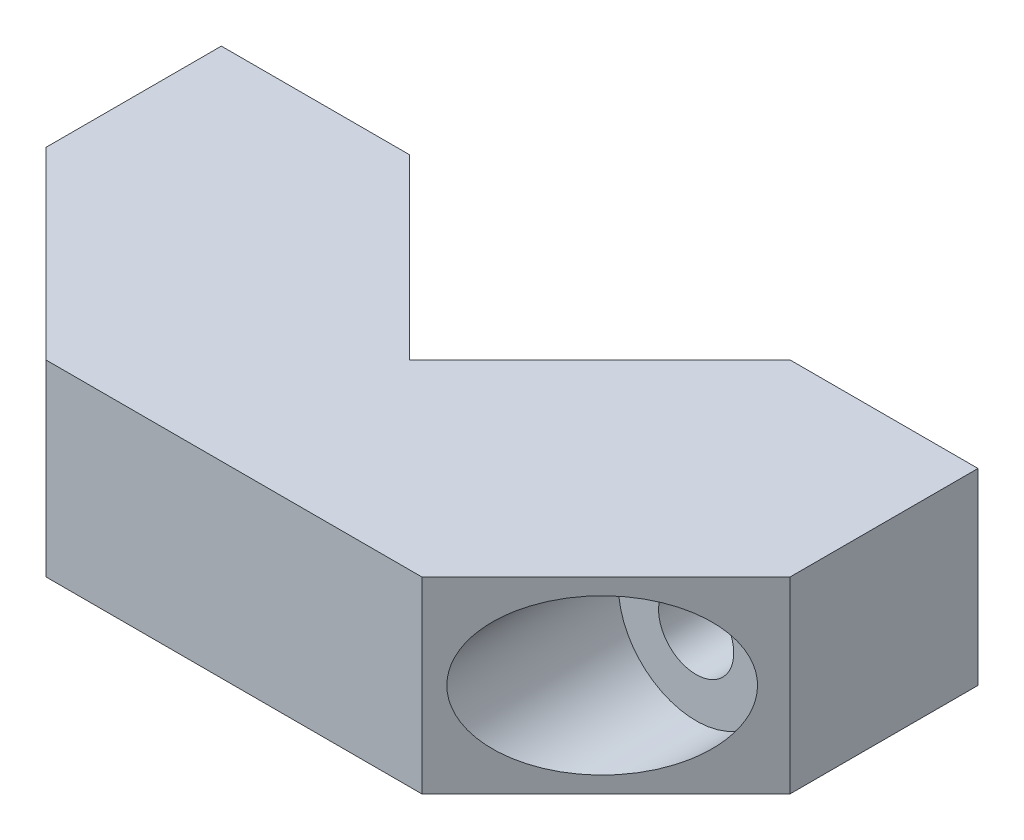
ISO-10303-21;
HEADER;
FILE_DESCRIPTION(('STEP AP214'),'2;1');
FILE_NAME('part.step','',(''),(''),'','','');
FILE_SCHEMA(('AUTOMOTIVE_DESIGN { 1 0 10303 214 1 1 1 1 }'));
ENDSEC;
DATA;
#1=APPLICATION_CONTEXT('core data for automotive mechanical design processes');
#2=APPLICATION_PROTOCOL_DEFINITION('international standard','automotive_design',2000,#1);
#3=PRODUCT_CONTEXT('',#1,'mechanical');
#4=PRODUCT('Part','Part','',(#3));
#5=PRODUCT_RELATED_PRODUCT_CATEGORY('part','',(#4));
#6=PRODUCT_DEFINITION_FORMATION('','',#4);
#7=PRODUCT_DEFINITION_CONTEXT('part definition',#1,'design');
#8=PRODUCT_DEFINITION('design','',#6,#7);
#9=PRODUCT_DEFINITION_SHAPE('','',#8);
#10=(LENGTH_UNIT() NAMED_UNIT(*) SI_UNIT(.MILLI.,.METRE.));
#11=(NAMED_UNIT(*) PLANE_ANGLE_UNIT() SI_UNIT($,.RADIAN.));
#12=(NAMED_UNIT(*) SI_UNIT($,.STERADIAN.) SOLID_ANGLE_UNIT());
#13=UNCERTAINTY_MEASURE_WITH_UNIT(LENGTH_MEASURE(1.E-05),#10,'distance_accuracy_value','');
#14=(GEOMETRIC_REPRESENTATION_CONTEXT(3) GLOBAL_UNCERTAINTY_ASSIGNED_CONTEXT((#13)) GLOBAL_UNIT_ASSIGNED_CONTEXT((#10,
#11,#12)) REPRESENTATION_CONTEXT('',''));
#15=CARTESIAN_POINT('',(0.,0.,0.));
#16=DIRECTION('',(0.,0.,1.));
#17=DIRECTION('',(1.,0.,0.));
#18=AXIS2_PLACEMENT_3D('',#15,#16,#17);
#19=CARTESIAN_POINT('',(-36.1259523138163,12.7,-11.8011320819841));
#20=DIRECTION('',(0.,0.,1.));
#21=DIRECTION('',(1.,0.,0.));
#22=AXIS2_PLACEMENT_3D('',#19,#20,#21);
#23=PLANE('',#22);
#24=CARTESIAN_POINT('',(-29.7759523138163,6.35,-11.8011320819841));
#25=DIRECTION('',(0.,0.,1.));
#26=DIRECTION('',(1.,0.,0.));
#27=AXIS2_PLACEMENT_3D('',#24,#25,#26);
#28=CIRCLE('',#27,2.54);
#29=CARTESIAN_POINT('',(-27.2359523138163,6.35,-11.8011320819841));
#30=VERTEX_POINT('',#29);
#31=EDGE_CURVE('E155',#30,#30,#28,.F.);
#32=ORIENTED_EDGE('',*,*,#31,.F.);
#33=EDGE_LOOP('',(#32));
#34=FACE_BOUND('',#33,.T.);
#35=DIRECTION('',(-1.,0.,0.));
#36=VECTOR('',#35,1.);
#37=CARTESIAN_POINT('',(-36.1259523138163,0.,-11.8011320819841));
#38=LINE('',#37,#36);
#39=CARTESIAN_POINT('',(-23.4259523138163,0.,-11.8011320819841));
#40=VERTEX_POINT('',#39);
#41=CARTESIAN_POINT('',(-36.1259523138163,0.,-11.8011320819841));
#42=VERTEX_POINT('',#41);
#43=EDGE_CURVE('E151',#40,#42,#38,.T.);
#44=ORIENTED_EDGE('',*,*,#43,.T.);
#45=DIRECTION('',(0.,-1.,0.));
#46=VECTOR('',#45,1.);
#47=CARTESIAN_POINT('',(-36.1259523138163,12.7,-11.8011320819841));
#48=LINE('',#47,#46);
#49=CARTESIAN_POINT('',(-36.1259523138163,12.7,-11.8011320819841));
#50=VERTEX_POINT('',#49);
#51=EDGE_CURVE('E13',#50,#42,#48,.T.);
#52=ORIENTED_EDGE('',*,*,#51,.F.);
#53=DIRECTION('',(-1.,0.,0.));
#54=VECTOR('',#53,1.);
#55=CARTESIAN_POINT('',(-36.1259523138163,12.7,-11.8011320819841));
#56=LINE('',#55,#54);
#57=CARTESIAN_POINT('',(-23.4259523138163,12.7,-11.8011320819841));
#58=VERTEX_POINT('',#57);
#59=EDGE_CURVE('E168',#58,#50,#56,.T.);
#60=ORIENTED_EDGE('',*,*,#59,.F.);
#61=DIRECTION('',(0.,-1.,0.));
#62=VECTOR('',#61,1.);
#63=CARTESIAN_POINT('',(-23.4259523138163,12.7,-11.8011320819841));
#64=LINE('',#63,#62);
#65=EDGE_CURVE('E147',#58,#40,#64,.T.);
#66=ORIENTED_EDGE('',*,*,#65,.T.);
#67=EDGE_LOOP('',(#44,#52,#60,#66));
#68=FACE_BOUND('',#67,.T.);
#69=ADVANCED_FACE('F47',(#34,#68),#23,.F.);
#70=CARTESIAN_POINT('',(-36.1259523138163,12.7,0.0503397805920884));
#71=DIRECTION('',(1.,0.,0.));
#72=DIRECTION('',(0.,0.,-1.));
#73=AXIS2_PLACEMENT_3D('',#70,#71,#72);
#74=PLANE('',#73);
#75=DIRECTION('',(0.,0.,1.));
#76=VECTOR('',#75,1.);
#77=CARTESIAN_POINT('',(-36.1259523138163,0.,0.0503397805920884));
#78=LINE('',#77,#76);
#79=CARTESIAN_POINT('',(-36.1259523138163,0.,0.0503397805920884));
#80=VERTEX_POINT('',#79);
#81=EDGE_CURVE('E154',#42,#80,#78,.T.);
#82=ORIENTED_EDGE('',*,*,#81,.T.);
#83=DIRECTION('',(0.,-1.,0.));
#84=VECTOR('',#83,1.);
#85=CARTESIAN_POINT('',(-36.1259523138163,12.7,0.0503397805920884));
#86=LINE('',#85,#84);
#87=CARTESIAN_POINT('',(-36.1259523138163,12.7,0.0503397805920884));
#88=VERTEX_POINT('',#87);
#89=EDGE_CURVE('E56',#88,#80,#86,.T.);
#90=ORIENTED_EDGE('',*,*,#89,.F.);
#91=DIRECTION('',(0.,0.,1.));
#92=VECTOR('',#91,1.);
#93=CARTESIAN_POINT('',(-36.1259523138163,12.7,0.0503397805920884));
#94=LINE('',#93,#92);
#95=EDGE_CURVE('E111',#50,#88,#94,.T.);
#96=ORIENTED_EDGE('',*,*,#95,.F.);
#97=ORIENTED_EDGE('',*,*,#51,.T.);
#98=EDGE_LOOP('',(#82,#90,#96,#97));
#99=FACE_BOUND('',#98,.T.);
#100=ADVANCED_FACE('F242',(#99),#74,.F.);
#101=CARTESIAN_POINT('',(-23.6808729649331,12.7,12.4954191294753));
#102=DIRECTION('',(0.707106781186546,0.,-0.707106781186549));
#103=DIRECTION('',(-0.707106781186549,0.,-0.707106781186546));
#104=AXIS2_PLACEMENT_3D('',#101,#102,#103);
#105=PLANE('',#104);
#106=CARTESIAN_POINT('',(-29.7759523138163,6.35,6.40033978059208));
#107=DIRECTION('',(0.707106781186546,0.,-0.707106781186549));
#108=DIRECTION('',(-0.707106781186549,0.,-0.707106781186546));
#109=AXIS2_PLACEMENT_3D('',#106,#107,#108);
#110=ELLIPSE('',#109,7.42462120245873,5.24999999999999);
#111=CARTESIAN_POINT('',(-35.0259523138163,6.35,1.1503397805921));
#112=VERTEX_POINT('',#111);
#113=EDGE_CURVE('E50',#112,#112,#110,.T.);
#114=ORIENTED_EDGE('',*,*,#113,.T.);
#115=EDGE_LOOP('',(#114));
#116=FACE_BOUND('',#115,.T.);
#117=DIRECTION('',(0.707106781186549,0.,0.707106781186546));
#118=VECTOR('',#117,1.);
#119=CARTESIAN_POINT('',(-23.6808729649331,0.,12.4954191294753));
#120=LINE('',#119,#118);
#121=CARTESIAN_POINT('',(-23.6808729649331,0.,12.4954191294753));
#122=VERTEX_POINT('',#121);
#123=EDGE_CURVE('E157',#80,#122,#120,.T.);
#124=ORIENTED_EDGE('',*,*,#123,.T.);
#125=DIRECTION('',(0.,-1.,0.));
#126=VECTOR('',#125,1.);
#127=CARTESIAN_POINT('',(-23.6808729649331,12.7,12.4954191294753));
#128=LINE('',#127,#126);
#129=CARTESIAN_POINT('',(-23.6808729649331,12.7,12.4954191294753));
#130=VERTEX_POINT('',#129);
#131=EDGE_CURVE('E178',#130,#122,#128,.T.);
#132=ORIENTED_EDGE('',*,*,#131,.F.);
#133=DIRECTION('',(0.707106781186549,0.,0.707106781186546));
#134=VECTOR('',#133,1.);
#135=CARTESIAN_POINT('',(-23.6808729649331,12.7,12.4954191294753));
#136=LINE('',#135,#134);
#137=EDGE_CURVE('E209',#88,#130,#136,.T.);
#138=ORIENTED_EDGE('',*,*,#137,.F.);
#139=ORIENTED_EDGE('',*,*,#89,.T.);
#140=EDGE_LOOP('',(#124,#132,#138,#139));
#141=FACE_BOUND('',#140,.T.);
#142=ADVANCED_FACE('F247',(#116,#141),#105,.F.);
#143=CARTESIAN_POINT('',(1.71912703506694,12.7,12.4954191294753));
#144=DIRECTION('',(0.,0.,-1.));
#145=DIRECTION('',(-1.,0.,0.));
#146=AXIS2_PLACEMENT_3D('',#143,#144,#145);
#147=PLANE('',#146);
#148=DIRECTION('',(1.,0.,0.));
#149=VECTOR('',#148,1.);
#150=CARTESIAN_POINT('',(1.71912703506694,0.,12.4954191294753));
#151=LINE('',#150,#149);
#152=CARTESIAN_POINT('',(1.71912703506694,0.,12.4954191294753));
#153=VERTEX_POINT('',#152);
#154=EDGE_CURVE('E159',#122,#153,#151,.T.);
#155=ORIENTED_EDGE('',*,*,#154,.T.);
#156=DIRECTION('',(0.,-1.,0.));
#157=VECTOR('',#156,1.);
#158=CARTESIAN_POINT('',(1.71912703506694,12.7,12.4954191294753));
#159=LINE('',#158,#157);
#160=CARTESIAN_POINT('',(1.71912703506694,12.7,12.4954191294753));
#161=VERTEX_POINT('',#160);
#162=EDGE_CURVE('E175',#161,#153,#159,.T.);
#163=ORIENTED_EDGE('',*,*,#162,.F.);
#164=DIRECTION('',(1.,0.,0.));
#165=VECTOR('',#164,1.);
#166=CARTESIAN_POINT('',(1.71912703506694,12.7,12.4954191294753));
#167=LINE('',#166,#165);
#168=EDGE_CURVE('E211',#130,#161,#167,.T.);
#169=ORIENTED_EDGE('',*,*,#168,.F.);
#170=ORIENTED_EDGE('',*,*,#131,.T.);
#171=EDGE_LOOP('',(#155,#163,#169,#170));
#172=FACE_BOUND('',#171,.T.);
#173=ADVANCED_FACE('F293',(#172),#147,.F.);
#174=CARTESIAN_POINT('',(14.1642063839502,12.7,0.0503397805920406));
#175=DIRECTION('',(-0.707106781186549,0.,-0.707106781186546));
#176=DIRECTION('',(-0.707106781186546,0.,0.707106781186549));
#177=AXIS2_PLACEMENT_3D('',#174,#175,#176);
#178=PLANE('',#177);
#179=CARTESIAN_POINT('',(7.81420638395017,6.35,6.40033978059206));
#180=DIRECTION('',(-0.707106781186549,0.,-0.707106781186546));
#181=DIRECTION('',(0.707106781186546,0.,-0.707106781186549));
#182=AXIS2_PLACEMENT_3D('',#179,#180,#181);
#183=ELLIPSE('',#182,7.42462120245876,5.25);
#184=CARTESIAN_POINT('',(13.0642063839502,6.35,1.15033978059204));
#185=VERTEX_POINT('',#184);
#186=EDGE_CURVE('E185',#185,#185,#183,.T.);
#187=ORIENTED_EDGE('',*,*,#186,.T.);
#188=EDGE_LOOP('',(#187));
#189=FACE_BOUND('',#188,.T.);
#190=DIRECTION('',(0.707106781186546,0.,-0.707106781186549));
#191=VECTOR('',#190,1.);
#192=CARTESIAN_POINT('',(14.1642063839502,0.,0.0503397805920406));
#193=LINE('',#192,#191);
#194=CARTESIAN_POINT('',(14.1642063839502,0.,0.0503397805920406));
#195=VERTEX_POINT('',#194);
#196=EDGE_CURVE('E161',#153,#195,#193,.T.);
#197=ORIENTED_EDGE('',*,*,#196,.T.);
#198=DIRECTION('',(0.,-1.,0.));
#199=VECTOR('',#198,1.);
#200=CARTESIAN_POINT('',(14.1642063839502,12.7,0.0503397805920406));
#201=LINE('',#200,#199);
#202=CARTESIAN_POINT('',(14.1642063839502,12.7,0.0503397805920406));
#203=VERTEX_POINT('',#202);
#204=EDGE_CURVE('E172',#203,#195,#201,.T.);
#205=ORIENTED_EDGE('',*,*,#204,.F.);
#206=DIRECTION('',(0.707106781186546,0.,-0.707106781186549));
#207=VECTOR('',#206,1.);
#208=CARTESIAN_POINT('',(14.1642063839502,12.7,0.0503397805920406));
#209=LINE('',#208,#207);
#210=EDGE_CURVE('E213',#161,#203,#209,.T.);
#211=ORIENTED_EDGE('',*,*,#210,.F.);
#212=ORIENTED_EDGE('',*,*,#162,.T.);
#213=EDGE_LOOP('',(#197,#205,#211,#212));
#214=FACE_BOUND('',#213,.T.);
#215=ADVANCED_FACE('F219',(#189,#214),#178,.F.);
#216=CARTESIAN_POINT('',(14.1642063839502,12.7,-12.649660219408));
#217=DIRECTION('',(-1.,0.,0.));
#218=DIRECTION('',(0.,0.,1.));
#219=AXIS2_PLACEMENT_3D('',#216,#217,#218);
#220=PLANE('',#219);
#221=DIRECTION('',(0.,0.,-1.));
#222=VECTOR('',#221,1.);
#223=CARTESIAN_POINT('',(14.1642063839502,0.,-12.649660219408));
#224=LINE('',#223,#222);
#225=CARTESIAN_POINT('',(14.1642063839502,0.,-12.649660219408));
#226=VERTEX_POINT('',#225);
#227=EDGE_CURVE('E163',#195,#226,#224,.T.);
#228=ORIENTED_EDGE('',*,*,#227,.T.);
#229=DIRECTION('',(0.,-1.,0.));
#230=VECTOR('',#229,1.);
#231=CARTESIAN_POINT('',(14.1642063839502,12.7,-12.649660219408));
#232=LINE('',#231,#230);
#233=CARTESIAN_POINT('',(14.1642063839502,12.7,-12.649660219408));
#234=VERTEX_POINT('',#233);
#235=EDGE_CURVE('E142',#234,#226,#232,.T.);
#236=ORIENTED_EDGE('',*,*,#235,.F.);
#237=DIRECTION('',(0.,0.,-1.));
#238=VECTOR('',#237,1.);
#239=CARTESIAN_POINT('',(14.1642063839502,12.7,-12.649660219408));
#240=LINE('',#239,#238);
#241=EDGE_CURVE('E133',#203,#234,#240,.T.);
#242=ORIENTED_EDGE('',*,*,#241,.F.);
#243=ORIENTED_EDGE('',*,*,#204,.T.);
#244=EDGE_LOOP('',(#228,#236,#242,#243));
#245=FACE_BOUND('',#244,.T.);
#246=ADVANCED_FACE('F223',(#245),#220,.F.);
#247=CARTESIAN_POINT('',(1.46420638395016,12.7,-12.649660219408));
#248=DIRECTION('',(0.,0.,1.));
#249=DIRECTION('',(1.,0.,0.));
#250=AXIS2_PLACEMENT_3D('',#247,#248,#249);
#251=PLANE('',#250);
#252=CARTESIAN_POINT('',(7.81420638395016,6.35,-12.649660219408));
#253=DIRECTION('',(0.,0.,1.));
#254=DIRECTION('',(1.,0.,0.));
#255=AXIS2_PLACEMENT_3D('',#252,#253,#254);
#256=CIRCLE('',#255,2.54);
#257=CARTESIAN_POINT('',(10.3542063839502,6.35,-12.649660219408));
#258=VERTEX_POINT('',#257);
#259=EDGE_CURVE('E184',#258,#258,#256,.T.);
#260=ORIENTED_EDGE('',*,*,#259,.T.);
#261=EDGE_LOOP('',(#260));
#262=FACE_BOUND('',#261,.T.);
#263=DIRECTION('',(-1.,0.,0.));
#264=VECTOR('',#263,1.);
#265=CARTESIAN_POINT('',(1.46420638395016,0.,-12.649660219408));
#266=LINE('',#265,#264);
#267=CARTESIAN_POINT('',(1.46420638395016,0.,-12.649660219408));
#268=VERTEX_POINT('',#267);
#269=EDGE_CURVE('E141',#226,#268,#266,.T.);
#270=ORIENTED_EDGE('',*,*,#269,.T.);
#271=DIRECTION('',(0.,-1.,0.));
#272=VECTOR('',#271,1.);
#273=CARTESIAN_POINT('',(1.46420638395016,12.7,-12.649660219408));
#274=LINE('',#273,#272);
#275=CARTESIAN_POINT('',(1.46420638395016,12.7,-12.649660219408));
#276=VERTEX_POINT('',#275);
#277=EDGE_CURVE('E138',#276,#268,#274,.T.);
#278=ORIENTED_EDGE('',*,*,#277,.F.);
#279=DIRECTION('',(-1.,0.,0.));
#280=VECTOR('',#279,1.);
#281=CARTESIAN_POINT('',(1.46420638395016,12.7,-12.649660219408));
#282=LINE('',#281,#280);
#283=EDGE_CURVE('E127',#234,#276,#282,.T.);
#284=ORIENTED_EDGE('',*,*,#283,.F.);
#285=ORIENTED_EDGE('',*,*,#235,.T.);
#286=EDGE_LOOP('',(#270,#278,#284,#285));
#287=FACE_BOUND('',#286,.T.);
#288=ADVANCED_FACE('F139',(#262,#287),#251,.F.);
#289=CARTESIAN_POINT('',(-11.405137033645,12.7,0.219683198187236));
#290=DIRECTION('',(0.707106781186549,0.,0.707106781186546));
#291=DIRECTION('',(0.707106781186546,0.,-0.707106781186549));
#292=AXIS2_PLACEMENT_3D('',#289,#290,#291);
#293=PLANE('',#292);
#294=DIRECTION('',(-0.707106781186546,0.,0.707106781186549));
#295=VECTOR('',#294,1.);
#296=CARTESIAN_POINT('',(-11.405137033645,0.,0.219683198187236));
#297=LINE('',#296,#295);
#298=CARTESIAN_POINT('',(-11.405137033645,0.,0.219683198187236));
#299=VERTEX_POINT('',#298);
#300=EDGE_CURVE('E97',#268,#299,#297,.T.);
#301=ORIENTED_EDGE('',*,*,#300,.T.);
#302=DIRECTION('',(0.,-1.,0.));
#303=VECTOR('',#302,1.);
#304=CARTESIAN_POINT('',(-11.405137033645,12.7,0.219683198187236));
#305=LINE('',#304,#303);
#306=CARTESIAN_POINT('',(-11.405137033645,12.7,0.219683198187236));
#307=VERTEX_POINT('',#306);
#308=EDGE_CURVE('E143',#307,#299,#305,.T.);
#309=ORIENTED_EDGE('',*,*,#308,.F.);
#310=DIRECTION('',(-0.707106781186546,0.,0.707106781186549));
#311=VECTOR('',#310,1.);
#312=CARTESIAN_POINT('',(-11.405137033645,12.7,0.219683198187236));
#313=LINE('',#312,#311);
#314=EDGE_CURVE('E131',#276,#307,#313,.T.);
#315=ORIENTED_EDGE('',*,*,#314,.F.);
#316=ORIENTED_EDGE('',*,*,#277,.T.);
#317=EDGE_LOOP('',(#301,#309,#315,#316));
#318=FACE_BOUND('',#317,.T.);
#319=ADVANCED_FACE('F145',(#318),#293,.F.);
#320=CARTESIAN_POINT('',(-23.4259523138163,12.7,-11.8011320819841));
#321=DIRECTION('',(-0.707106781186546,0.,0.707106781186549));
#322=DIRECTION('',(0.707106781186549,0.,0.707106781186546));
#323=AXIS2_PLACEMENT_3D('',#320,#321,#322);
#324=PLANE('',#323);
#325=DIRECTION('',(-0.707106781186549,0.,-0.707106781186546));
#326=VECTOR('',#325,1.);
#327=CARTESIAN_POINT('',(-23.4259523138163,0.,-11.8011320819841));
#328=LINE('',#327,#326);
#329=EDGE_CURVE('E103',#299,#40,#328,.T.);
#330=ORIENTED_EDGE('',*,*,#329,.T.);
#331=ORIENTED_EDGE('',*,*,#65,.F.);
#332=DIRECTION('',(-0.707106781186549,0.,-0.707106781186546));
#333=VECTOR('',#332,1.);
#334=CARTESIAN_POINT('',(-23.4259523138163,12.7,-11.8011320819841));
#335=LINE('',#334,#333);
#336=EDGE_CURVE('E65',#307,#58,#335,.T.);
#337=ORIENTED_EDGE('',*,*,#336,.F.);
#338=ORIENTED_EDGE('',*,*,#308,.T.);
#339=EDGE_LOOP('',(#330,#331,#337,#338));
#340=FACE_BOUND('',#339,.T.);
#341=ADVANCED_FACE('F231',(#340),#324,.F.);
#342=CARTESIAN_POINT('',(0.,12.7,0.));
#343=DIRECTION('',(0.,-1.,0.));
#344=DIRECTION('',(0.,0.,-1.));
#345=AXIS2_PLACEMENT_3D('',#342,#343,#344);
#346=PLANE('',#345);
#347=ORIENTED_EDGE('',*,*,#59,.T.);
#348=ORIENTED_EDGE('',*,*,#95,.T.);
#349=ORIENTED_EDGE('',*,*,#137,.T.);
#350=ORIENTED_EDGE('',*,*,#168,.T.);
#351=ORIENTED_EDGE('',*,*,#210,.T.);
#352=ORIENTED_EDGE('',*,*,#241,.T.);
#353=ORIENTED_EDGE('',*,*,#283,.T.);
#354=ORIENTED_EDGE('',*,*,#314,.T.);
#355=ORIENTED_EDGE('',*,*,#336,.T.);
#356=EDGE_LOOP('',(#347,#348,#349,#350,#351,#352,#353,#354,#355));
#357=FACE_BOUND('',#356,.T.);
#358=ADVANCED_FACE('F129',(#357),#346,.F.);
#359=CARTESIAN_POINT('',(0.,0.,0.));
#360=DIRECTION('',(0.,-1.,0.));
#361=DIRECTION('',(0.,0.,-1.));
#362=AXIS2_PLACEMENT_3D('',#359,#360,#361);
#363=PLANE('',#362);
#364=ORIENTED_EDGE('',*,*,#43,.F.);
#365=ORIENTED_EDGE('',*,*,#329,.F.);
#366=ORIENTED_EDGE('',*,*,#300,.F.);
#367=ORIENTED_EDGE('',*,*,#269,.F.);
#368=ORIENTED_EDGE('',*,*,#227,.F.);
#369=ORIENTED_EDGE('',*,*,#196,.F.);
#370=ORIENTED_EDGE('',*,*,#154,.F.);
#371=ORIENTED_EDGE('',*,*,#123,.F.);
#372=ORIENTED_EDGE('',*,*,#81,.F.);
#373=EDGE_LOOP('',(#364,#365,#366,#367,#368,#369,#370,#371,#372));
#374=FACE_BOUND('',#373,.T.);
#375=ADVANCED_FACE('F226',(#374),#363,.T.);
#376=CARTESIAN_POINT('',(7.81420638395016,6.35,0.0503397805920493));
#377=DIRECTION('',(0.,0.,-1.));
#378=DIRECTION('',(-1.,0.,0.));
#379=AXIS2_PLACEMENT_3D('',#376,#377,#378);
#380=CYLINDRICAL_SURFACE('',#379,2.54);
#381=CARTESIAN_POINT('',(7.81420638395016,6.35,0.0503397805920493));
#382=DIRECTION('',(0.,0.,1.));
#383=DIRECTION('',(1.,0.,0.));
#384=AXIS2_PLACEMENT_3D('',#381,#382,#383);
#385=CIRCLE('',#384,2.54);
#386=CARTESIAN_POINT('',(10.3542063839502,6.35,0.0503397805920489));
#387=VERTEX_POINT('',#386);
#388=EDGE_CURVE('E200',#387,#387,#385,.T.);
#389=ORIENTED_EDGE('',*,*,#388,.T.);
#390=EDGE_LOOP('',(#389));
#391=FACE_BOUND('',#390,.T.);
#392=ORIENTED_EDGE('',*,*,#259,.F.);
#393=EDGE_LOOP('',(#392));
#394=FACE_BOUND('',#393,.T.);
#395=ADVANCED_FACE('F253',(#391,#394),#380,.F.);
#396=CARTESIAN_POINT('',(-29.7759523138163,6.35,0.0503397805920527));
#397=DIRECTION('',(0.,0.,-1.));
#398=DIRECTION('',(-1.,0.,0.));
#399=AXIS2_PLACEMENT_3D('',#396,#397,#398);
#400=CYLINDRICAL_SURFACE('',#399,2.54);
#401=CARTESIAN_POINT('',(-29.7759523138163,6.35,0.0503397805920527));
#402=DIRECTION('',(0.,0.,1.));
#403=DIRECTION('',(1.,0.,0.));
#404=AXIS2_PLACEMENT_3D('',#401,#402,#403);
#405=CIRCLE('',#404,2.54);
#406=CARTESIAN_POINT('',(-27.2359523138163,6.35,0.0503397805920524));
#407=VERTEX_POINT('',#406);
#408=EDGE_CURVE('E191',#407,#407,#405,.T.);
#409=ORIENTED_EDGE('',*,*,#408,.T.);
#410=EDGE_LOOP('',(#409));
#411=FACE_BOUND('',#410,.T.);
#412=ORIENTED_EDGE('',*,*,#31,.T.);
#413=EDGE_LOOP('',(#412));
#414=FACE_BOUND('',#413,.T.);
#415=ADVANCED_FACE('F250',(#411,#414),#400,.F.);
#416=CARTESIAN_POINT('',(7.81420638395016,6.35,0.0503397805920486));
#417=DIRECTION('',(0.,0.,-1.));
#418=DIRECTION('',(-1.,0.,0.));
#419=AXIS2_PLACEMENT_3D('',#416,#417,#418);
#420=PLANE('',#419);
#421=CARTESIAN_POINT('',(7.81420638395016,6.35,0.0503397805920486));
#422=DIRECTION('',(0.,0.,-1.));
#423=DIRECTION('',(-1.,0.,0.));
#424=AXIS2_PLACEMENT_3D('',#421,#422,#423);
#425=CIRCLE('',#424,5.25);
#426=CARTESIAN_POINT('',(2.56420638395016,6.35,0.0503397805920498));
#427=VERTEX_POINT('',#426);
#428=EDGE_CURVE('E187',#427,#427,#425,.T.);
#429=ORIENTED_EDGE('',*,*,#428,.F.);
#430=EDGE_LOOP('',(#429));
#431=FACE_BOUND('',#430,.T.);
#432=ORIENTED_EDGE('',*,*,#388,.F.);
#433=EDGE_LOOP('',(#432));
#434=FACE_BOUND('',#433,.T.);
#435=ADVANCED_FACE('F252',(#431,#434),#420,.F.);
#436=CARTESIAN_POINT('',(7.81420638395017,6.35,12.750339780592));
#437=DIRECTION('',(0.,0.,-1.));
#438=DIRECTION('',(-1.,0.,0.));
#439=AXIS2_PLACEMENT_3D('',#436,#437,#438);
#440=CYLINDRICAL_SURFACE('',#439,5.25);
#441=ORIENTED_EDGE('',*,*,#428,.T.);
#442=EDGE_LOOP('',(#441));
#443=FACE_BOUND('',#442,.T.);
#444=ORIENTED_EDGE('',*,*,#186,.F.);
#445=EDGE_LOOP('',(#444));
#446=FACE_BOUND('',#445,.T.);
#447=ADVANCED_FACE('F260',(#443,#446),#440,.F.);
#448=CARTESIAN_POINT('',(-29.7759523138163,6.35,0.050339780592057));
#449=DIRECTION('',(0.,0.,-1.));
#450=DIRECTION('',(-1.,0.,0.));
#451=AXIS2_PLACEMENT_3D('',#448,#449,#450);
#452=PLANE('',#451);
#453=CARTESIAN_POINT('',(-29.7759523138163,6.35,0.050339780592057));
#454=DIRECTION('',(0.,0.,-1.));
#455=DIRECTION('',(-1.,0.,0.));
#456=AXIS2_PLACEMENT_3D('',#453,#454,#455);
#457=CIRCLE('',#456,5.24999999999999);
#458=CARTESIAN_POINT('',(-35.0259523138163,6.35,0.0503397805920581));
#459=VERTEX_POINT('',#458);
#460=EDGE_CURVE('E193',#459,#459,#457,.T.);
#461=ORIENTED_EDGE('',*,*,#460,.F.);
#462=EDGE_LOOP('',(#461));
#463=FACE_BOUND('',#462,.T.);
#464=ORIENTED_EDGE('',*,*,#408,.F.);
#465=EDGE_LOOP('',(#464));
#466=FACE_BOUND('',#465,.T.);
#467=ADVANCED_FACE('F321',(#463,#466),#452,.F.);
#468=CARTESIAN_POINT('',(-29.7759523138163,6.35,12.7503397805921));
#469=DIRECTION('',(0.,0.,-1.));
#470=DIRECTION('',(-1.,0.,0.));
#471=AXIS2_PLACEMENT_3D('',#468,#469,#470);
#472=CYLINDRICAL_SURFACE('',#471,5.24999999999999);
#473=ORIENTED_EDGE('',*,*,#460,.T.);
#474=EDGE_LOOP('',(#473));
#475=FACE_BOUND('',#474,.T.);
#476=ORIENTED_EDGE('',*,*,#113,.F.);
#477=EDGE_LOOP('',(#476));
#478=FACE_BOUND('',#477,.T.);
#479=ADVANCED_FACE('F330',(#475,#478),#472,.F.);
#480=CLOSED_SHELL('',(#69,#100,#142,#173,#215,#246,#288,#319,#341,#358,#375,#395,#415,#435,#447,
#467,#479));
#481=MANIFOLD_SOLID_BREP('B2',#480);
#482=ADVANCED_BREP_SHAPE_REPRESENTATION('',(#18,#481),#14);
#483=SHAPE_DEFINITION_REPRESENTATION(#9,#482);
ENDSEC;
END-ISO-10303-21;
